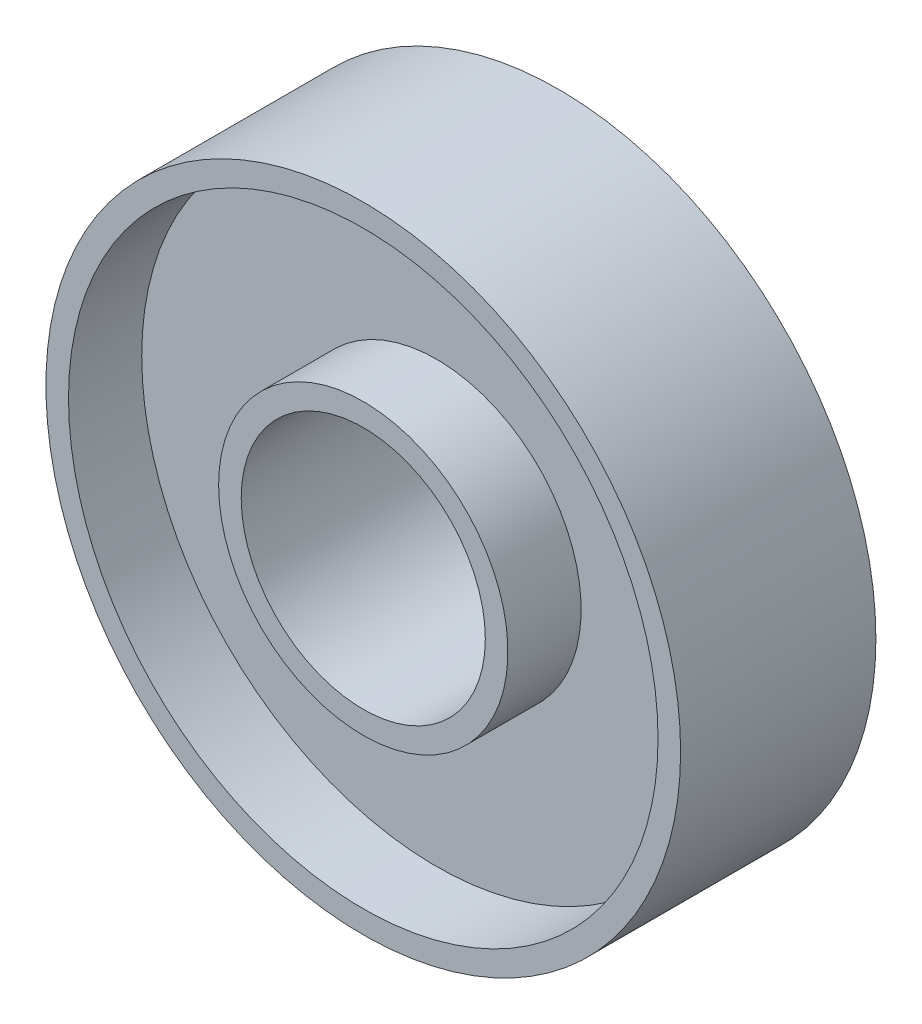
ISO-10303-21;
HEADER;
FILE_DESCRIPTION(('STEP AP214'),'2;1');
FILE_NAME('part.step','',(''),(''),'','','');
FILE_SCHEMA(('AUTOMOTIVE_DESIGN { 1 0 10303 214 1 1 1 1 }'));
ENDSEC;
DATA;
#1=APPLICATION_CONTEXT('core data for automotive mechanical design processes');
#2=APPLICATION_PROTOCOL_DEFINITION('international standard','automotive_design',2000,#1);
#3=PRODUCT_CONTEXT('',#1,'mechanical');
#4=PRODUCT('Part','Part','',(#3));
#5=PRODUCT_RELATED_PRODUCT_CATEGORY('part','',(#4));
#6=PRODUCT_DEFINITION_FORMATION('','',#4);
#7=PRODUCT_DEFINITION_CONTEXT('part definition',#1,'design');
#8=PRODUCT_DEFINITION('design','',#6,#7);
#9=PRODUCT_DEFINITION_SHAPE('','',#8);
#10=(LENGTH_UNIT() NAMED_UNIT(*) SI_UNIT(.MILLI.,.METRE.));
#11=(NAMED_UNIT(*) PLANE_ANGLE_UNIT() SI_UNIT($,.RADIAN.));
#12=(NAMED_UNIT(*) SI_UNIT($,.STERADIAN.) SOLID_ANGLE_UNIT());
#13=UNCERTAINTY_MEASURE_WITH_UNIT(LENGTH_MEASURE(1.E-05),#10,'distance_accuracy_value','');
#14=(GEOMETRIC_REPRESENTATION_CONTEXT(3) GLOBAL_UNCERTAINTY_ASSIGNED_CONTEXT((#13)) GLOBAL_UNIT_ASSIGNED_CONTEXT((#10,
#11,#12)) REPRESENTATION_CONTEXT('',''));
#15=CARTESIAN_POINT('',(0.,0.,0.));
#16=DIRECTION('',(0.,0.,1.));
#17=DIRECTION('',(1.,0.,0.));
#18=AXIS2_PLACEMENT_3D('',#15,#16,#17);
#19=CARTESIAN_POINT('',(0.,0.,8.));
#20=DIRECTION('',(0.,0.,-1.));
#21=DIRECTION('',(-1.,0.,0.));
#22=AXIS2_PLACEMENT_3D('',#19,#20,#21);
#23=CYLINDRICAL_SURFACE('',#22,12.075);
#24=CARTESIAN_POINT('',(0.,0.,8.));
#25=DIRECTION('',(0.,0.,1.));
#26=DIRECTION('',(1.,0.,0.));
#27=AXIS2_PLACEMENT_3D('',#24,#25,#26);
#28=CIRCLE('',#27,12.075);
#29=CARTESIAN_POINT('',(12.075,0.,8.));
#30=VERTEX_POINT('',#29);
#31=EDGE_CURVE('E53',#30,#30,#28,.T.);
#32=ORIENTED_EDGE('',*,*,#31,.T.);
#33=EDGE_LOOP('',(#32));
#34=FACE_BOUND('',#33,.T.);
#35=CARTESIAN_POINT('',(0.,0.,5.));
#36=DIRECTION('',(0.,0.,-1.));
#37=DIRECTION('',(-1.,0.,0.));
#38=AXIS2_PLACEMENT_3D('',#35,#36,#37);
#39=CIRCLE('',#38,12.075);
#40=CARTESIAN_POINT('',(-12.075,0.,5.));
#41=VERTEX_POINT('',#40);
#42=EDGE_CURVE('E60',#41,#41,#39,.T.);
#43=ORIENTED_EDGE('',*,*,#42,.T.);
#44=EDGE_LOOP('',(#43));
#45=FACE_BOUND('',#44,.T.);
#46=ADVANCED_FACE('F34',(#34,#45),#23,.F.);
#47=CARTESIAN_POINT('',(0.,0.,8.));
#48=DIRECTION('',(0.,0.,1.));
#49=DIRECTION('',(1.,0.,0.));
#50=AXIS2_PLACEMENT_3D('',#47,#48,#49);
#51=PLANE('',#50);
#52=CARTESIAN_POINT('',(0.,0.,8.));
#53=DIRECTION('',(0.,0.,1.));
#54=DIRECTION('',(1.,0.,0.));
#55=AXIS2_PLACEMENT_3D('',#52,#53,#54);
#56=CIRCLE('',#55,13.);
#57=CARTESIAN_POINT('',(13.,0.,8.));
#58=VERTEX_POINT('',#57);
#59=EDGE_CURVE('E47',#58,#58,#56,.T.);
#60=ORIENTED_EDGE('',*,*,#59,.T.);
#61=EDGE_LOOP('',(#60));
#62=FACE_BOUND('',#61,.T.);
#63=ORIENTED_EDGE('',*,*,#31,.F.);
#64=EDGE_LOOP('',(#63));
#65=FACE_BOUND('',#64,.T.);
#66=ADVANCED_FACE('F99',(#62,#65),#51,.T.);
#67=CARTESIAN_POINT('',(0.,0.,0.));
#68=DIRECTION('',(0.,0.,1.));
#69=DIRECTION('',(1.,0.,0.));
#70=AXIS2_PLACEMENT_3D('',#67,#68,#69);
#71=PLANE('',#70);
#72=CARTESIAN_POINT('',(0.,0.,0.));
#73=DIRECTION('',(0.,0.,1.));
#74=DIRECTION('',(1.,0.,0.));
#75=AXIS2_PLACEMENT_3D('',#72,#73,#74);
#76=CIRCLE('',#75,13.);
#77=CARTESIAN_POINT('',(13.,0.,0.));
#78=VERTEX_POINT('',#77);
#79=EDGE_CURVE('E56',#78,#78,#76,.T.);
#80=ORIENTED_EDGE('',*,*,#79,.F.);
#81=EDGE_LOOP('',(#80));
#82=FACE_BOUND('',#81,.T.);
#83=CARTESIAN_POINT('',(0.,0.,0.));
#84=DIRECTION('',(0.,0.,1.));
#85=DIRECTION('',(1.,0.,0.));
#86=AXIS2_PLACEMENT_3D('',#83,#84,#85);
#87=CIRCLE('',#86,12.075);
#88=CARTESIAN_POINT('',(12.075,0.,0.));
#89=VERTEX_POINT('',#88);
#90=EDGE_CURVE('E57',#89,#89,#87,.T.);
#91=ORIENTED_EDGE('',*,*,#90,.T.);
#92=EDGE_LOOP('',(#91));
#93=FACE_BOUND('',#92,.T.);
#94=ADVANCED_FACE('F106',(#82,#93),#71,.F.);
#95=CARTESIAN_POINT('',(0.,0.,8.));
#96=DIRECTION('',(0.,0.,-1.));
#97=DIRECTION('',(-1.,0.,0.));
#98=AXIS2_PLACEMENT_3D('',#95,#96,#97);
#99=CYLINDRICAL_SURFACE('',#98,13.);
#100=ORIENTED_EDGE('',*,*,#59,.F.);
#101=EDGE_LOOP('',(#100));
#102=FACE_BOUND('',#101,.T.);
#103=ORIENTED_EDGE('',*,*,#79,.T.);
#104=EDGE_LOOP('',(#103));
#105=FACE_BOUND('',#104,.T.);
#106=ADVANCED_FACE('F36',(#102,#105),#99,.T.);
#107=CARTESIAN_POINT('',(0.,0.,3.));
#108=DIRECTION('',(0.,0.,-1.));
#109=DIRECTION('',(-1.,0.,0.));
#110=AXIS2_PLACEMENT_3D('',#107,#108,#109);
#111=CIRCLE('',#110,12.075);
#112=CARTESIAN_POINT('',(-12.075,0.,3.));
#113=VERTEX_POINT('',#112);
#114=EDGE_CURVE('E42',#113,#113,#111,.T.);
#115=ORIENTED_EDGE('',*,*,#114,.F.);
#116=EDGE_LOOP('',(#115));
#117=FACE_BOUND('',#116,.T.);
#118=ORIENTED_EDGE('',*,*,#90,.F.);
#119=EDGE_LOOP('',(#118));
#120=FACE_BOUND('',#119,.T.);
#121=ADVANCED_FACE('F102',(#117,#120),#23,.F.);
#122=CARTESIAN_POINT('',(0.,0.,3.));
#123=DIRECTION('',(0.,0.,-1.));
#124=DIRECTION('',(-1.,0.,0.));
#125=AXIS2_PLACEMENT_3D('',#122,#123,#124);
#126=PLANE('',#125);
#127=CARTESIAN_POINT('',(0.,0.,3.));
#128=DIRECTION('',(0.,0.,-1.));
#129=DIRECTION('',(-1.,0.,0.));
#130=AXIS2_PLACEMENT_3D('',#127,#128,#129);
#131=CIRCLE('',#130,5.925);
#132=CARTESIAN_POINT('',(-5.925,0.,3.));
#133=VERTEX_POINT('',#132);
#134=EDGE_CURVE('E10',#133,#133,#131,.T.);
#135=ORIENTED_EDGE('',*,*,#134,.F.);
#136=EDGE_LOOP('',(#135));
#137=FACE_BOUND('',#136,.T.);
#138=ORIENTED_EDGE('',*,*,#114,.T.);
#139=EDGE_LOOP('',(#138));
#140=FACE_BOUND('',#139,.T.);
#141=ADVANCED_FACE('F111',(#137,#140),#126,.T.);
#142=CARTESIAN_POINT('',(0.,0.,5.));
#143=DIRECTION('',(0.,0.,-1.));
#144=DIRECTION('',(-1.,0.,0.));
#145=AXIS2_PLACEMENT_3D('',#142,#143,#144);
#146=PLANE('',#145);
#147=CARTESIAN_POINT('',(0.,0.,5.));
#148=DIRECTION('',(0.,0.,-1.));
#149=DIRECTION('',(-1.,0.,0.));
#150=AXIS2_PLACEMENT_3D('',#147,#148,#149);
#151=CIRCLE('',#150,5.925);
#152=CARTESIAN_POINT('',(-5.925,0.,5.));
#153=VERTEX_POINT('',#152);
#154=EDGE_CURVE('E38',#153,#153,#151,.T.);
#155=ORIENTED_EDGE('',*,*,#154,.T.);
#156=EDGE_LOOP('',(#155));
#157=FACE_BOUND('',#156,.T.);
#158=ORIENTED_EDGE('',*,*,#42,.F.);
#159=EDGE_LOOP('',(#158));
#160=FACE_BOUND('',#159,.T.);
#161=ADVANCED_FACE('F117',(#157,#160),#146,.F.);
#162=CARTESIAN_POINT('',(0.,0.,8.));
#163=DIRECTION('',(0.,0.,-1.));
#164=DIRECTION('',(-1.,0.,0.));
#165=AXIS2_PLACEMENT_3D('',#162,#163,#164);
#166=CYLINDRICAL_SURFACE('',#165,5.925);
#167=CARTESIAN_POINT('',(0.,0.,8.));
#168=DIRECTION('',(0.,0.,-1.));
#169=DIRECTION('',(-1.,0.,0.));
#170=AXIS2_PLACEMENT_3D('',#167,#168,#169);
#171=CIRCLE('',#170,5.925);
#172=CARTESIAN_POINT('',(-5.925,0.,8.));
#173=VERTEX_POINT('',#172);
#174=EDGE_CURVE('E51',#173,#173,#171,.T.);
#175=ORIENTED_EDGE('',*,*,#174,.T.);
#176=EDGE_LOOP('',(#175));
#177=FACE_BOUND('',#176,.T.);
#178=ORIENTED_EDGE('',*,*,#154,.F.);
#179=EDGE_LOOP('',(#178));
#180=FACE_BOUND('',#179,.T.);
#181=ADVANCED_FACE('F96',(#177,#180),#166,.T.);
#182=CARTESIAN_POINT('',(0.,0.,8.));
#183=DIRECTION('',(0.,0.,-1.));
#184=DIRECTION('',(-1.,0.,0.));
#185=AXIS2_PLACEMENT_3D('',#182,#183,#184);
#186=PLANE('',#185);
#187=CARTESIAN_POINT('',(0.,0.,8.));
#188=DIRECTION('',(0.,0.,-1.));
#189=DIRECTION('',(-1.,0.,0.));
#190=AXIS2_PLACEMENT_3D('',#187,#188,#189);
#191=CIRCLE('',#190,5.);
#192=CARTESIAN_POINT('',(-5.,0.,8.));
#193=VERTEX_POINT('',#192);
#194=EDGE_CURVE('E71',#193,#193,#191,.T.);
#195=ORIENTED_EDGE('',*,*,#194,.T.);
#196=EDGE_LOOP('',(#195));
#197=FACE_BOUND('',#196,.T.);
#198=ORIENTED_EDGE('',*,*,#174,.F.);
#199=EDGE_LOOP('',(#198));
#200=FACE_BOUND('',#199,.T.);
#201=ADVANCED_FACE('F167',(#197,#200),#186,.F.);
#202=CARTESIAN_POINT('',(0.,0.,8.));
#203=DIRECTION('',(0.,0.,-1.));
#204=DIRECTION('',(-1.,0.,0.));
#205=AXIS2_PLACEMENT_3D('',#202,#203,#204);
#206=CYLINDRICAL_SURFACE('',#205,5.);
#207=ORIENTED_EDGE('',*,*,#194,.F.);
#208=EDGE_LOOP('',(#207));
#209=FACE_BOUND('',#208,.T.);
#210=CARTESIAN_POINT('',(0.,0.,0.));
#211=DIRECTION('',(0.,0.,-1.));
#212=DIRECTION('',(-1.,0.,0.));
#213=AXIS2_PLACEMENT_3D('',#210,#211,#212);
#214=CIRCLE('',#213,5.);
#215=CARTESIAN_POINT('',(-5.,0.,0.));
#216=VERTEX_POINT('',#215);
#217=EDGE_CURVE('E79',#216,#216,#214,.T.);
#218=ORIENTED_EDGE('',*,*,#217,.T.);
#219=EDGE_LOOP('',(#218));
#220=FACE_BOUND('',#219,.T.);
#221=ADVANCED_FACE('F85',(#209,#220),#206,.F.);
#222=ORIENTED_EDGE('',*,*,#134,.T.);
#223=EDGE_LOOP('',(#222));
#224=FACE_BOUND('',#223,.T.);
#225=CARTESIAN_POINT('',(0.,0.,0.));
#226=DIRECTION('',(0.,0.,-1.));
#227=DIRECTION('',(-1.,0.,0.));
#228=AXIS2_PLACEMENT_3D('',#225,#226,#227);
#229=CIRCLE('',#228,5.925);
#230=CARTESIAN_POINT('',(-5.925,0.,0.));
#231=VERTEX_POINT('',#230);
#232=EDGE_CURVE('E75',#231,#231,#229,.T.);
#233=ORIENTED_EDGE('',*,*,#232,.F.);
#234=EDGE_LOOP('',(#233));
#235=FACE_BOUND('',#234,.T.);
#236=ADVANCED_FACE('F89',(#224,#235),#166,.T.);
#237=CARTESIAN_POINT('',(0.,0.,0.));
#238=DIRECTION('',(0.,0.,-1.));
#239=DIRECTION('',(-1.,0.,0.));
#240=AXIS2_PLACEMENT_3D('',#237,#238,#239);
#241=PLANE('',#240);
#242=ORIENTED_EDGE('',*,*,#232,.T.);
#243=EDGE_LOOP('',(#242));
#244=FACE_BOUND('',#243,.T.);
#245=ORIENTED_EDGE('',*,*,#217,.F.);
#246=EDGE_LOOP('',(#245));
#247=FACE_BOUND('',#246,.T.);
#248=ADVANCED_FACE('F87',(#244,#247),#241,.T.);
#249=CLOSED_SHELL('',(#46,#66,#94,#106,#121,#141,#161,#181,#201,#221,#236,#248));
#250=MANIFOLD_SOLID_BREP('B2',#249);
#251=ADVANCED_BREP_SHAPE_REPRESENTATION('',(#18,#250),#14);
#252=SHAPE_DEFINITION_REPRESENTATION(#9,#251);
ENDSEC;
END-ISO-10303-21;
